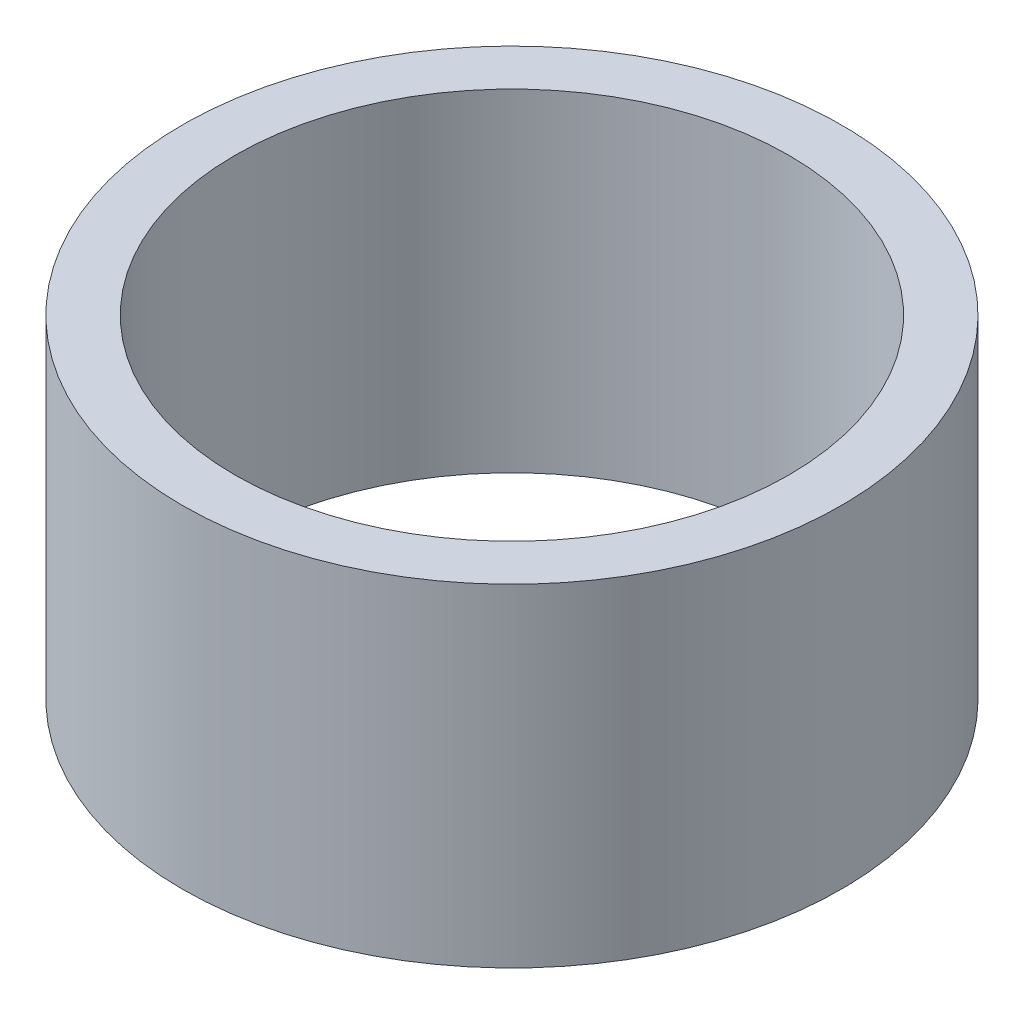
ISO-10303-21;
HEADER;
FILE_DESCRIPTION(('STEP AP214'),'2;1');
FILE_NAME('part.step','',(''),(''),'','','');
FILE_SCHEMA(('AUTOMOTIVE_DESIGN { 1 0 10303 214 1 1 1 1 }'));
ENDSEC;
DATA;
#1=APPLICATION_CONTEXT('core data for automotive mechanical design processes');
#2=APPLICATION_PROTOCOL_DEFINITION('international standard','automotive_design',2000,#1);
#3=PRODUCT_CONTEXT('',#1,'mechanical');
#4=PRODUCT('Part','Part','',(#3));
#5=PRODUCT_RELATED_PRODUCT_CATEGORY('part','',(#4));
#6=PRODUCT_DEFINITION_FORMATION('','',#4);
#7=PRODUCT_DEFINITION_CONTEXT('part definition',#1,'design');
#8=PRODUCT_DEFINITION('design','',#6,#7);
#9=PRODUCT_DEFINITION_SHAPE('','',#8);
#10=(LENGTH_UNIT() NAMED_UNIT(*) SI_UNIT(.MILLI.,.METRE.));
#11=(NAMED_UNIT(*) PLANE_ANGLE_UNIT() SI_UNIT($,.RADIAN.));
#12=(NAMED_UNIT(*) SI_UNIT($,.STERADIAN.) SOLID_ANGLE_UNIT());
#13=UNCERTAINTY_MEASURE_WITH_UNIT(LENGTH_MEASURE(1.E-05),#10,'distance_accuracy_value','');
#14=(GEOMETRIC_REPRESENTATION_CONTEXT(3) GLOBAL_UNCERTAINTY_ASSIGNED_CONTEXT((#13)) GLOBAL_UNIT_ASSIGNED_CONTEXT((#10,
#11,#12)) REPRESENTATION_CONTEXT('',''));
#15=CARTESIAN_POINT('',(0.,0.,0.));
#16=DIRECTION('',(0.,0.,1.));
#17=DIRECTION('',(1.,0.,0.));
#18=AXIS2_PLACEMENT_3D('',#15,#16,#17);
#19=CARTESIAN_POINT('',(0.,0.,0.));
#20=DIRECTION('',(0.,-1.,0.));
#21=DIRECTION('',(0.,0.,-1.));
#22=AXIS2_PLACEMENT_3D('',#19,#20,#21);
#23=PLANE('',#22);
#24=CARTESIAN_POINT('',(0.,0.,0.));
#25=DIRECTION('',(0.,1.,0.));
#26=DIRECTION('',(0.,0.,1.));
#27=AXIS2_PLACEMENT_3D('',#24,#25,#26);
#28=CIRCLE('',#27,12.5);
#29=CARTESIAN_POINT('',(0.,0.,12.5));
#30=VERTEX_POINT('',#29);
#31=EDGE_CURVE('E60',#30,#30,#28,.T.);
#32=ORIENTED_EDGE('',*,*,#31,.F.);
#33=EDGE_LOOP('',(#32));
#34=FACE_BOUND('',#33,.T.);
#35=CARTESIAN_POINT('',(0.,0.,0.));
#36=DIRECTION('',(0.,1.,0.));
#37=DIRECTION('',(0.,0.,1.));
#38=AXIS2_PLACEMENT_3D('',#35,#36,#37);
#39=CIRCLE('',#38,14.875);
#40=CARTESIAN_POINT('',(0.,0.,14.875));
#41=VERTEX_POINT('',#40);
#42=EDGE_CURVE('E10',#41,#41,#39,.T.);
#43=ORIENTED_EDGE('',*,*,#42,.T.);
#44=EDGE_LOOP('',(#43));
#45=FACE_BOUND('',#44,.T.);
#46=ADVANCED_FACE('F43',(#34,#45),#23,.F.);
#47=CARTESIAN_POINT('',(0.,0.,0.));
#48=DIRECTION('',(0.,1.,0.));
#49=DIRECTION('',(0.,0.,1.));
#50=AXIS2_PLACEMENT_3D('',#47,#48,#49);
#51=CYLINDRICAL_SURFACE('',#50,14.875);
#52=ORIENTED_EDGE('',*,*,#42,.F.);
#53=EDGE_LOOP('',(#52));
#54=FACE_BOUND('',#53,.T.);
#55=CARTESIAN_POINT('',(0.,-15.,0.));
#56=DIRECTION('',(0.,1.,0.));
#57=DIRECTION('',(0.,0.,1.));
#58=AXIS2_PLACEMENT_3D('',#55,#56,#57);
#59=CIRCLE('',#58,14.875);
#60=CARTESIAN_POINT('',(0.,-15.,14.875));
#61=VERTEX_POINT('',#60);
#62=EDGE_CURVE('E50',#61,#61,#59,.T.);
#63=ORIENTED_EDGE('',*,*,#62,.T.);
#64=EDGE_LOOP('',(#63));
#65=FACE_BOUND('',#64,.T.);
#66=ADVANCED_FACE('F70',(#54,#65),#51,.T.);
#67=CARTESIAN_POINT('',(14.875,-15.,0.));
#68=DIRECTION('',(0.,1.,0.));
#69=DIRECTION('',(0.,0.,1.));
#70=AXIS2_PLACEMENT_3D('',#67,#68,#69);
#71=PLANE('',#70);
#72=CARTESIAN_POINT('',(0.,-15.,0.));
#73=DIRECTION('',(0.,1.,0.));
#74=DIRECTION('',(0.,0.,1.));
#75=AXIS2_PLACEMENT_3D('',#72,#73,#74);
#76=CIRCLE('',#75,12.5);
#77=CARTESIAN_POINT('',(0.,-15.,12.5));
#78=VERTEX_POINT('',#77);
#79=EDGE_CURVE('E55',#78,#78,#76,.T.);
#80=ORIENTED_EDGE('',*,*,#79,.T.);
#81=EDGE_LOOP('',(#80));
#82=FACE_BOUND('',#81,.T.);
#83=ORIENTED_EDGE('',*,*,#62,.F.);
#84=EDGE_LOOP('',(#83));
#85=FACE_BOUND('',#84,.T.);
#86=ADVANCED_FACE('F74',(#82,#85),#71,.F.);
#87=CARTESIAN_POINT('',(0.,-15.,0.));
#88=DIRECTION('',(0.,1.,0.));
#89=DIRECTION('',(0.,0.,1.));
#90=AXIS2_PLACEMENT_3D('',#87,#88,#89);
#91=CYLINDRICAL_SURFACE('',#90,12.5);
#92=CARTESIAN_POINT('',(0.,-15.,12.5));
#93=CARTESIAN_POINT('',(0.,-14.84375,12.5));
#94=CARTESIAN_POINT('',(0.,-14.6875,12.5));
#95=CARTESIAN_POINT('',(0.,-14.375,12.5));
#96=CARTESIAN_POINT('',(0.,-14.21875,12.5));
#97=CARTESIAN_POINT('',(0.,-13.90625,12.5));
#98=CARTESIAN_POINT('',(0.,-13.75,12.5));
#99=CARTESIAN_POINT('',(0.,-13.4375,12.5));
#100=CARTESIAN_POINT('',(0.,-13.28125,12.5));
#101=CARTESIAN_POINT('',(0.,-12.96875,12.5));
#102=CARTESIAN_POINT('',(0.,-12.8125,12.5));
#103=CARTESIAN_POINT('',(0.,-12.5,12.5));
#104=CARTESIAN_POINT('',(0.,-12.34375,12.5));
#105=CARTESIAN_POINT('',(0.,-12.03125,12.5));
#106=CARTESIAN_POINT('',(0.,-11.875,12.5));
#107=CARTESIAN_POINT('',(0.,-11.5625,12.5));
#108=CARTESIAN_POINT('',(0.,-11.40625,12.5));
#109=CARTESIAN_POINT('',(0.,-11.09375,12.5));
#110=CARTESIAN_POINT('',(0.,-10.9375,12.5));
#111=CARTESIAN_POINT('',(0.,-10.625,12.5));
#112=CARTESIAN_POINT('',(0.,-10.46875,12.5));
#113=CARTESIAN_POINT('',(0.,-10.15625,12.5));
#114=CARTESIAN_POINT('',(0.,-10.,12.5));
#115=CARTESIAN_POINT('',(0.,-9.6875,12.5));
#116=CARTESIAN_POINT('',(0.,-9.53125,12.5));
#117=CARTESIAN_POINT('',(0.,-9.21875,12.5));
#118=CARTESIAN_POINT('',(0.,-9.0625,12.5));
#119=CARTESIAN_POINT('',(0.,-8.75,12.5));
#120=CARTESIAN_POINT('',(0.,-8.59375,12.5));
#121=CARTESIAN_POINT('',(0.,-8.28125,12.5));
#122=CARTESIAN_POINT('',(0.,-8.125,12.5));
#123=CARTESIAN_POINT('',(0.,-7.8125,12.5));
#124=CARTESIAN_POINT('',(0.,-7.65625,12.5));
#125=CARTESIAN_POINT('',(0.,-7.34375,12.5));
#126=CARTESIAN_POINT('',(0.,-7.1875,12.5));
#127=CARTESIAN_POINT('',(0.,-6.875,12.5));
#128=CARTESIAN_POINT('',(0.,-6.71875,12.5));
#129=CARTESIAN_POINT('',(0.,-6.40625,12.5));
#130=CARTESIAN_POINT('',(0.,-6.25,12.5));
#131=CARTESIAN_POINT('',(0.,-5.9375,12.5));
#132=CARTESIAN_POINT('',(0.,-5.78125,12.5));
#133=CARTESIAN_POINT('',(0.,-5.46875,12.5));
#134=CARTESIAN_POINT('',(0.,-5.3125,12.5));
#135=CARTESIAN_POINT('',(0.,-5.,12.5));
#136=CARTESIAN_POINT('',(0.,-4.84375,12.5));
#137=CARTESIAN_POINT('',(0.,-4.53125,12.5));
#138=CARTESIAN_POINT('',(0.,-4.375,12.5));
#139=CARTESIAN_POINT('',(0.,-4.0625,12.5));
#140=CARTESIAN_POINT('',(0.,-3.90625,12.5));
#141=CARTESIAN_POINT('',(0.,-3.59375,12.5));
#142=CARTESIAN_POINT('',(0.,-3.4375,12.5));
#143=CARTESIAN_POINT('',(0.,-3.125,12.5));
#144=CARTESIAN_POINT('',(0.,-2.96875,12.5));
#145=CARTESIAN_POINT('',(0.,-2.65625,12.5));
#146=CARTESIAN_POINT('',(0.,-2.5,12.5));
#147=CARTESIAN_POINT('',(0.,-2.1875,12.5));
#148=CARTESIAN_POINT('',(0.,-2.03125,12.5));
#149=CARTESIAN_POINT('',(0.,-1.71875,12.5));
#150=CARTESIAN_POINT('',(0.,-1.5625,12.5));
#151=CARTESIAN_POINT('',(0.,-1.25,12.5));
#152=CARTESIAN_POINT('',(0.,-1.09375,12.5));
#153=CARTESIAN_POINT('',(0.,-0.781250000000001,12.5));
#154=CARTESIAN_POINT('',(0.,-0.625000000000001,12.5));
#155=CARTESIAN_POINT('',(0.,-0.3125,12.5));
#156=CARTESIAN_POINT('',(0.,-0.15625,12.5));
#157=CARTESIAN_POINT('',(0.,0.,12.5));
#158=B_SPLINE_CURVE_WITH_KNOTS('',3,(#92,#93,#94,#95,#96,#97,#98,#99,#100,#101,#102,#103,#104,
#105,#106,#107,#108,#109,#110,#111,#112,#113,#114,#115,#116,#117,#118,#119,#120,#121,#122,#123,
#124,#125,#126,#127,#128,#129,#130,#131,#132,#133,#134,#135,#136,#137,#138,#139,#140,#141,#142,
#143,#144,#145,#146,#147,#148,#149,#150,#151,#152,#153,#154,#155,#156,#157),.UNSPECIFIED.,.F.,
.F.,(4,2,2,2,2,2,2,2,2,2,2,2,2,2,2,2,2,2,2,2,2,2,2,2,2,2,2,2,2,2,2,2,4),(0.,0.46875,
0.937500000000001,1.40625,1.875,2.34375,2.8125,3.28125,3.75,4.21875,4.6875,5.15625,5.625,
6.09375,6.5625,7.03125,7.5,7.96875,8.4375,8.90625,9.375,9.84375,10.3125,10.78125,11.25,11.71875,
12.1875,12.65625,13.125,13.59375,14.0625,14.53125,15.),.UNSPECIFIED.);
#159=EDGE_CURVE('BSEAM67',#78,#30,#158,.T.);
#160=ORIENTED_EDGE('',*,*,#79,.F.);
#161=ORIENTED_EDGE('',*,*,#31,.T.);
#162=ORIENTED_EDGE('',*,*,#159,.T.);
#163=ORIENTED_EDGE('',*,*,#159,.F.);
#164=EDGE_LOOP('',(#160,#162,#161,#163));
#165=FACE_BOUND('',#164,.T.);
#166=ADVANCED_FACE('F67',(#165),#91,.F.);
#167=CLOSED_SHELL('',(#46,#66,#86,#166));
#168=MANIFOLD_SOLID_BREP('B2',#167);
#169=ADVANCED_BREP_SHAPE_REPRESENTATION('',(#18,#168),#14);
#170=SHAPE_DEFINITION_REPRESENTATION(#9,#169);
ENDSEC;
END-ISO-10303-21;
